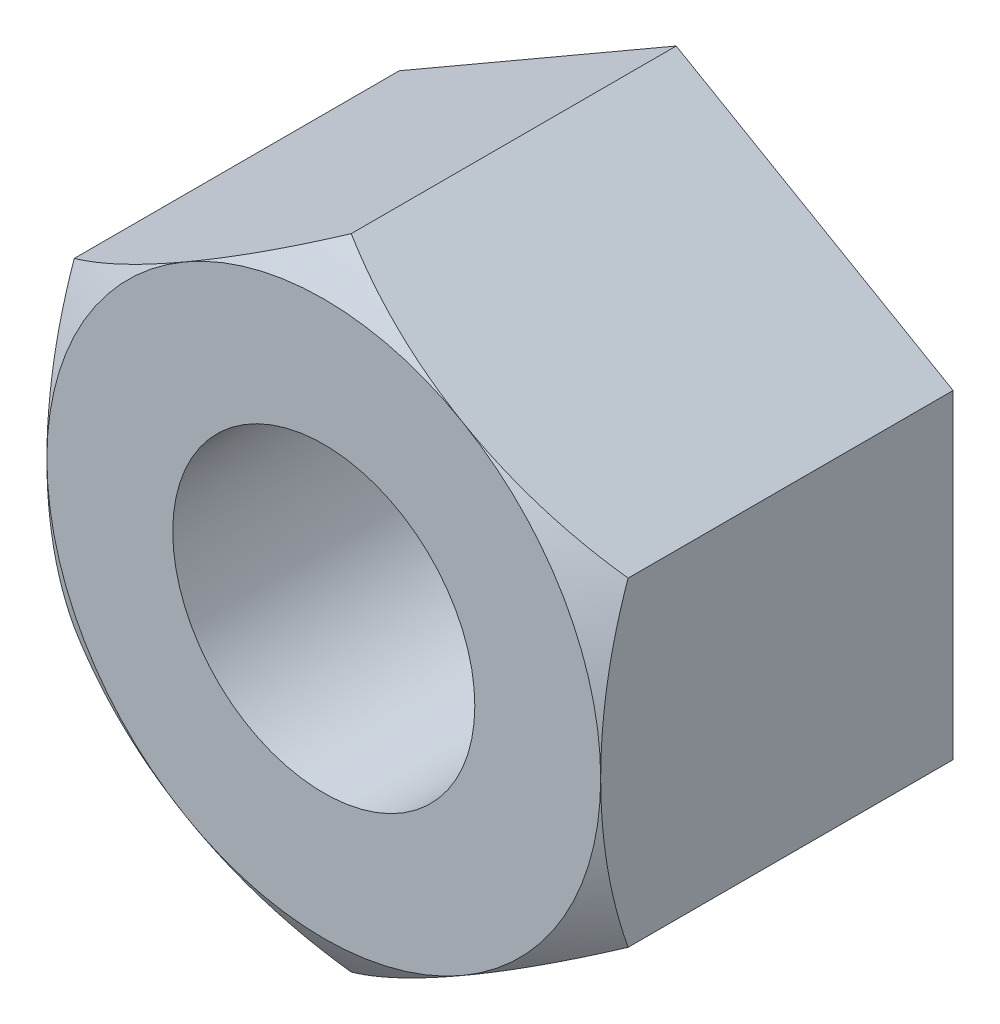
ISO-10303-21;
HEADER;
FILE_DESCRIPTION(('STEP AP214'),'2;1');
FILE_NAME('part.step','',(''),(''),'','','');
FILE_SCHEMA(('AUTOMOTIVE_DESIGN { 1 0 10303 214 1 1 1 1 }'));
ENDSEC;
DATA;
#1=APPLICATION_CONTEXT('core data for automotive mechanical design processes');
#2=APPLICATION_PROTOCOL_DEFINITION('international standard','automotive_design',2000,#1);
#3=PRODUCT_CONTEXT('',#1,'mechanical');
#4=PRODUCT('Part','Part','',(#3));
#5=PRODUCT_RELATED_PRODUCT_CATEGORY('part','',(#4));
#6=PRODUCT_DEFINITION_FORMATION('','',#4);
#7=PRODUCT_DEFINITION_CONTEXT('part definition',#1,'design');
#8=PRODUCT_DEFINITION('design','',#6,#7);
#9=PRODUCT_DEFINITION_SHAPE('','',#8);
#10=(LENGTH_UNIT() NAMED_UNIT(*) SI_UNIT(.MILLI.,.METRE.));
#11=(NAMED_UNIT(*) PLANE_ANGLE_UNIT() SI_UNIT($,.RADIAN.));
#12=(NAMED_UNIT(*) SI_UNIT($,.STERADIAN.) SOLID_ANGLE_UNIT());
#13=UNCERTAINTY_MEASURE_WITH_UNIT(LENGTH_MEASURE(1.E-05),#10,'distance_accuracy_value','');
#14=(GEOMETRIC_REPRESENTATION_CONTEXT(3) GLOBAL_UNCERTAINTY_ASSIGNED_CONTEXT((#13)) GLOBAL_UNIT_ASSIGNED_CONTEXT((#10,
#11,#12)) REPRESENTATION_CONTEXT('',''));
#15=CARTESIAN_POINT('',(0.,0.,0.));
#16=DIRECTION('',(0.,0.,1.));
#17=DIRECTION('',(1.,0.,0.));
#18=AXIS2_PLACEMENT_3D('',#15,#16,#17);
#19=CARTESIAN_POINT('',(0.,0.,3.5));
#20=DIRECTION('',(0.,0.,1.));
#21=DIRECTION('',(1.,0.,0.));
#22=AXIS2_PLACEMENT_3D('',#19,#20,#21);
#23=PLANE('',#22);
#24=CARTESIAN_POINT('',(0.,0.,3.49999999999998));
#25=DIRECTION('',(0.,0.,-1.));
#26=DIRECTION('',(0.,1.,0.));
#27=AXIS2_PLACEMENT_3D('',#24,#25,#26);
#28=CIRCLE('',#27,2.75);
#29=CARTESIAN_POINT('',(2.75,0.,3.49999999999998));
#30=VERTEX_POINT('',#29);
#31=CARTESIAN_POINT('',(1.37500000000002,-2.3815698604072,3.49999999999996));
#32=VERTEX_POINT('',#31);
#33=EDGE_CURVE('E176',#30,#32,#28,.T.);
#34=ORIENTED_EDGE('',*,*,#33,.F.);
#35=CARTESIAN_POINT('',(1.37499999999999,2.38156986040722,3.5));
#36=VERTEX_POINT('',#35);
#37=EDGE_CURVE('E175',#36,#30,#28,.T.);
#38=ORIENTED_EDGE('',*,*,#37,.F.);
#39=CARTESIAN_POINT('',(-1.375,2.38156986040721,3.5));
#40=VERTEX_POINT('',#39);
#41=EDGE_CURVE('E111',#40,#36,#28,.T.);
#42=ORIENTED_EDGE('',*,*,#41,.F.);
#43=CARTESIAN_POINT('',(-2.75,0.,3.49999999999998));
#44=VERTEX_POINT('',#43);
#45=EDGE_CURVE('E49',#44,#40,#28,.T.);
#46=ORIENTED_EDGE('',*,*,#45,.F.);
#47=CARTESIAN_POINT('',(-1.37499999999999,-2.38156986040721,3.49999999999996));
#48=VERTEX_POINT('',#47);
#49=EDGE_CURVE('E57',#48,#44,#28,.T.);
#50=ORIENTED_EDGE('',*,*,#49,.F.);
#51=EDGE_CURVE('E179',#32,#48,#28,.T.);
#52=ORIENTED_EDGE('',*,*,#51,.F.);
#53=EDGE_LOOP('',(#34,#38,#42,#46,#50,#52));
#54=FACE_BOUND('',#53,.T.);
#55=CARTESIAN_POINT('',(0.,0.,3.5));
#56=DIRECTION('',(0.,0.,1.));
#57=DIRECTION('',(1.,0.,0.));
#58=AXIS2_PLACEMENT_3D('',#55,#56,#57);
#59=CIRCLE('',#58,1.5);
#60=CARTESIAN_POINT('',(1.5,0.,3.5));
#61=VERTEX_POINT('',#60);
#62=EDGE_CURVE('E159',#61,#61,#59,.T.);
#63=ORIENTED_EDGE('',*,*,#62,.F.);
#64=EDGE_LOOP('',(#63));
#65=FACE_BOUND('',#64,.T.);
#66=ADVANCED_FACE('F34',(#54,#65),#23,.T.);
#67=CARTESIAN_POINT('',(0.,0.,0.));
#68=DIRECTION('',(0.,0.,1.));
#69=DIRECTION('',(1.,0.,0.));
#70=AXIS2_PLACEMENT_3D('',#67,#68,#69);
#71=PLANE('',#70);
#72=DIRECTION('',(-0.866025403784442,0.499999999999995,0.));
#73=VECTOR('',#72,1.);
#74=CARTESIAN_POINT('',(2.74999999999998,1.5877132402715,0.));
#75=LINE('',#74,#73);
#76=CARTESIAN_POINT('',(2.74999999999998,1.5877132402715,0.));
#77=VERTEX_POINT('',#76);
#78=CARTESIAN_POINT('',(0.,3.17542648054294,0.));
#79=VERTEX_POINT('',#78);
#80=EDGE_CURVE('E131',#77,#79,#75,.T.);
#81=ORIENTED_EDGE('',*,*,#80,.F.);
#82=DIRECTION('',(0.,1.,0.));
#83=VECTOR('',#82,1.);
#84=CARTESIAN_POINT('',(2.75000000000002,-1.58771324027145,0.));
#85=LINE('',#84,#83);
#86=CARTESIAN_POINT('',(2.75000000000002,-1.58771324027145,0.));
#87=VERTEX_POINT('',#86);
#88=EDGE_CURVE('E144',#87,#77,#85,.T.);
#89=ORIENTED_EDGE('',*,*,#88,.F.);
#90=DIRECTION('',(0.866025403784435,0.500000000000007,0.));
#91=VECTOR('',#90,1.);
#92=CARTESIAN_POINT('',(0.,-3.17542648054294,0.));
#93=LINE('',#92,#91);
#94=CARTESIAN_POINT('',(0.,-3.17542648054294,0.));
#95=VERTEX_POINT('',#94);
#96=EDGE_CURVE('E147',#95,#87,#93,.T.);
#97=ORIENTED_EDGE('',*,*,#96,.F.);
#98=DIRECTION('',(0.866025403784441,-0.499999999999995,0.));
#99=VECTOR('',#98,1.);
#100=CARTESIAN_POINT('',(-2.74999999999999,-1.58771324027148,0.));
#101=LINE('',#100,#99);
#102=CARTESIAN_POINT('',(-2.74999999999999,-1.58771324027148,0.));
#103=VERTEX_POINT('',#102);
#104=EDGE_CURVE('E150',#103,#95,#101,.T.);
#105=ORIENTED_EDGE('',*,*,#104,.F.);
#106=DIRECTION('',(0.,-1.,0.));
#107=VECTOR('',#106,1.);
#108=CARTESIAN_POINT('',(-2.75,1.58771324027147,0.));
#109=LINE('',#108,#107);
#110=CARTESIAN_POINT('',(-2.75,1.58771324027147,0.));
#111=VERTEX_POINT('',#110);
#112=EDGE_CURVE('E153',#111,#103,#109,.T.);
#113=ORIENTED_EDGE('',*,*,#112,.F.);
#114=DIRECTION('',(-0.866025403784438,-0.500000000000001,0.));
#115=VECTOR('',#114,1.);
#116=CARTESIAN_POINT('',(0.,3.17542648054294,0.));
#117=LINE('',#116,#115);
#118=EDGE_CURVE('E156',#79,#111,#117,.T.);
#119=ORIENTED_EDGE('',*,*,#118,.F.);
#120=EDGE_LOOP('',(#81,#89,#97,#105,#113,#119));
#121=FACE_BOUND('',#120,.T.);
#122=CARTESIAN_POINT('',(0.,0.,0.));
#123=DIRECTION('',(0.,0.,1.));
#124=DIRECTION('',(1.,0.,0.));
#125=AXIS2_PLACEMENT_3D('',#122,#123,#124);
#126=CIRCLE('',#125,1.5);
#127=CARTESIAN_POINT('',(1.5,0.,0.));
#128=VERTEX_POINT('',#127);
#129=EDGE_CURVE('E160',#128,#128,#126,.T.);
#130=ORIENTED_EDGE('',*,*,#129,.T.);
#131=EDGE_LOOP('',(#130));
#132=FACE_BOUND('',#131,.T.);
#133=ADVANCED_FACE('F205',(#121,#132),#71,.F.);
#134=CARTESIAN_POINT('',(2.74999999999998,1.5877132402715,3.5));
#135=DIRECTION('',(-0.499999999999995,-0.866025403784442,0.));
#136=DIRECTION('',(0.866025403784442,-0.499999999999995,0.));
#137=AXIS2_PLACEMENT_3D('',#134,#135,#136);
#138=PLANE('',#137);
#139=DIRECTION('',(0.,0.,-1.));
#140=VECTOR('',#139,1.);
#141=CARTESIAN_POINT('',(0.,3.17542648054294,3.5));
#142=LINE('',#141,#140);
#143=CARTESIAN_POINT('',(0.,3.17542648054294,3.22759147428808));
#144=VERTEX_POINT('',#143);
#145=EDGE_CURVE('E124',#144,#79,#142,.T.);
#146=ORIENTED_EDGE('',*,*,#145,.F.);
#147=CARTESIAN_POINT('',(1.37499999999999,2.38156986040722,-1.26313972081448));
#148=DIRECTION('',(-0.499999999999995,-0.866025403784442,0.));
#149=DIRECTION('',(0.866025403784442,-0.499999999999995,0.));
#150=AXIS2_PLACEMENT_3D('',#147,#148,#149);
#151=CIRCLE('',#150,4.76313972081447);
#152=EDGE_CURVE('E105',#144,#36,#151,.F.);
#153=ORIENTED_EDGE('',*,*,#152,.T.);
#154=CARTESIAN_POINT('',(2.74999999999998,1.5877132402715,3.22759147428807));
#155=VERTEX_POINT('',#154);
#156=EDGE_CURVE('E118',#36,#155,#151,.F.);
#157=ORIENTED_EDGE('',*,*,#156,.T.);
#158=DIRECTION('',(0.,0.,-1.));
#159=VECTOR('',#158,1.);
#160=CARTESIAN_POINT('',(2.74999999999998,1.5877132402715,3.5));
#161=LINE('',#160,#159);
#162=EDGE_CURVE('E142',#155,#77,#161,.T.);
#163=ORIENTED_EDGE('',*,*,#162,.T.);
#164=ORIENTED_EDGE('',*,*,#80,.T.);
#165=EDGE_LOOP('',(#146,#153,#157,#163,#164));
#166=FACE_BOUND('',#165,.T.);
#167=ADVANCED_FACE('F36',(#166),#138,.F.);
#168=CARTESIAN_POINT('',(0.,3.17542648054294,3.5));
#169=DIRECTION('',(0.500000000000001,-0.866025403784438,0.));
#170=DIRECTION('',(0.866025403784438,0.500000000000001,0.));
#171=AXIS2_PLACEMENT_3D('',#168,#169,#170);
#172=PLANE('',#171);
#173=DIRECTION('',(0.,0.,-1.));
#174=VECTOR('',#173,1.);
#175=CARTESIAN_POINT('',(-2.75,1.58771324027147,3.5));
#176=LINE('',#175,#174);
#177=CARTESIAN_POINT('',(-2.75,1.58771324027146,3.22759147428807));
#178=VERTEX_POINT('',#177);
#179=EDGE_CURVE('E132',#178,#111,#176,.T.);
#180=ORIENTED_EDGE('',*,*,#179,.F.);
#181=CARTESIAN_POINT('',(-1.375,2.3815698604072,-1.26313972081448));
#182=DIRECTION('',(0.500000000000001,-0.866025403784438,0.));
#183=DIRECTION('',(0.866025403784438,0.500000000000001,0.));
#184=AXIS2_PLACEMENT_3D('',#181,#182,#183);
#185=CIRCLE('',#184,4.76313972081448);
#186=EDGE_CURVE('E126',#178,#40,#185,.F.);
#187=ORIENTED_EDGE('',*,*,#186,.T.);
#188=EDGE_CURVE('E108',#40,#144,#185,.F.);
#189=ORIENTED_EDGE('',*,*,#188,.T.);
#190=ORIENTED_EDGE('',*,*,#145,.T.);
#191=ORIENTED_EDGE('',*,*,#118,.T.);
#192=EDGE_LOOP('',(#180,#187,#189,#190,#191));
#193=FACE_BOUND('',#192,.T.);
#194=ADVANCED_FACE('F122',(#193),#172,.F.);
#195=CARTESIAN_POINT('',(-2.75,1.58771324027147,3.5));
#196=DIRECTION('',(1.,0.,0.));
#197=DIRECTION('',(0.,1.,0.));
#198=AXIS2_PLACEMENT_3D('',#195,#196,#197);
#199=PLANE('',#198);
#200=DIRECTION('',(0.,0.,-1.));
#201=VECTOR('',#200,1.);
#202=CARTESIAN_POINT('',(-2.74999999999999,-1.58771324027148,3.5));
#203=LINE('',#202,#201);
#204=CARTESIAN_POINT('',(-2.74999999999997,-1.58771324027153,3.22759147428804));
#205=VERTEX_POINT('',#204);
#206=EDGE_CURVE('E134',#205,#103,#203,.T.);
#207=ORIENTED_EDGE('',*,*,#206,.F.);
#208=CARTESIAN_POINT('',(-2.75,0.,-1.26313972081448));
#209=DIRECTION('',(1.,0.,0.));
#210=DIRECTION('',(0.,1.,0.));
#211=AXIS2_PLACEMENT_3D('',#208,#209,#210);
#212=CIRCLE('',#211,4.76313972081448);
#213=EDGE_CURVE('E163',#205,#44,#212,.F.);
#214=ORIENTED_EDGE('',*,*,#213,.T.);
#215=EDGE_CURVE('E166',#44,#178,#212,.F.);
#216=ORIENTED_EDGE('',*,*,#215,.T.);
#217=ORIENTED_EDGE('',*,*,#179,.T.);
#218=ORIENTED_EDGE('',*,*,#112,.T.);
#219=EDGE_LOOP('',(#207,#214,#216,#217,#218));
#220=FACE_BOUND('',#219,.T.);
#221=ADVANCED_FACE('F210',(#220),#199,.F.);
#222=CARTESIAN_POINT('',(-2.74999999999999,-1.58771324027148,3.5));
#223=DIRECTION('',(0.499999999999995,0.866025403784441,0.));
#224=DIRECTION('',(-0.866025403784442,0.499999999999995,0.));
#225=AXIS2_PLACEMENT_3D('',#222,#223,#224);
#226=PLANE('',#225);
#227=DIRECTION('',(0.,0.,-1.));
#228=VECTOR('',#227,1.);
#229=CARTESIAN_POINT('',(0.,-3.17542648054294,3.5));
#230=LINE('',#229,#228);
#231=CARTESIAN_POINT('',(0.,-3.17542648054294,3.22759147428803));
#232=VERTEX_POINT('',#231);
#233=EDGE_CURVE('E138',#232,#95,#230,.T.);
#234=ORIENTED_EDGE('',*,*,#233,.F.);
#235=CARTESIAN_POINT('',(-1.37499999999999,-2.38156986040721,-1.26313972081448));
#236=DIRECTION('',(0.499999999999995,0.866025403784441,0.));
#237=DIRECTION('',(-0.866025403784442,0.499999999999995,0.));
#238=AXIS2_PLACEMENT_3D('',#235,#236,#237);
#239=CIRCLE('',#238,4.76313972081448);
#240=EDGE_CURVE('E127',#232,#48,#239,.F.);
#241=ORIENTED_EDGE('',*,*,#240,.T.);
#242=EDGE_CURVE('E168',#48,#205,#239,.F.);
#243=ORIENTED_EDGE('',*,*,#242,.T.);
#244=ORIENTED_EDGE('',*,*,#206,.T.);
#245=ORIENTED_EDGE('',*,*,#104,.T.);
#246=EDGE_LOOP('',(#234,#241,#243,#244,#245));
#247=FACE_BOUND('',#246,.T.);
#248=ADVANCED_FACE('F193',(#247),#226,.F.);
#249=CARTESIAN_POINT('',(0.,-3.17542648054294,3.5));
#250=DIRECTION('',(-0.500000000000007,0.866025403784434,0.));
#251=DIRECTION('',(-0.866025403784435,-0.500000000000007,0.));
#252=AXIS2_PLACEMENT_3D('',#249,#250,#251);
#253=PLANE('',#252);
#254=DIRECTION('',(0.,0.,-1.));
#255=VECTOR('',#254,1.);
#256=CARTESIAN_POINT('',(2.75000000000002,-1.58771324027145,3.5));
#257=LINE('',#256,#255);
#258=CARTESIAN_POINT('',(2.75000000000002,-1.58771324027145,3.22759147428808));
#259=VERTEX_POINT('',#258);
#260=EDGE_CURVE('E140',#259,#87,#257,.T.);
#261=ORIENTED_EDGE('',*,*,#260,.F.);
#262=CARTESIAN_POINT('',(1.37500000000002,-2.38156986040719,-1.26313972081448));
#263=DIRECTION('',(-0.500000000000007,0.866025403784434,0.));
#264=DIRECTION('',(-0.866025403784435,-0.500000000000007,0.));
#265=AXIS2_PLACEMENT_3D('',#262,#263,#264);
#266=CIRCLE('',#265,4.76313972081448);
#267=EDGE_CURVE('E172',#259,#32,#266,.F.);
#268=ORIENTED_EDGE('',*,*,#267,.T.);
#269=EDGE_CURVE('E117',#32,#232,#266,.F.);
#270=ORIENTED_EDGE('',*,*,#269,.T.);
#271=ORIENTED_EDGE('',*,*,#233,.T.);
#272=ORIENTED_EDGE('',*,*,#96,.T.);
#273=EDGE_LOOP('',(#261,#268,#270,#271,#272));
#274=FACE_BOUND('',#273,.T.);
#275=ADVANCED_FACE('F229',(#274),#253,.F.);
#276=CARTESIAN_POINT('',(2.75000000000002,-1.58771324027145,3.5));
#277=DIRECTION('',(-1.,0.,0.));
#278=DIRECTION('',(0.,-1.,0.));
#279=AXIS2_PLACEMENT_3D('',#276,#277,#278);
#280=PLANE('',#279);
#281=ORIENTED_EDGE('',*,*,#162,.F.);
#282=CARTESIAN_POINT('',(2.75,0.,-1.26313972081448));
#283=DIRECTION('',(-1.,0.,0.));
#284=DIRECTION('',(0.,-1.,0.));
#285=AXIS2_PLACEMENT_3D('',#282,#283,#284);
#286=CIRCLE('',#285,4.76313972081448);
#287=EDGE_CURVE('E11',#155,#30,#286,.F.);
#288=ORIENTED_EDGE('',*,*,#287,.T.);
#289=EDGE_CURVE('E38',#30,#259,#286,.F.);
#290=ORIENTED_EDGE('',*,*,#289,.T.);
#291=ORIENTED_EDGE('',*,*,#260,.T.);
#292=ORIENTED_EDGE('',*,*,#88,.T.);
#293=EDGE_LOOP('',(#281,#288,#290,#291,#292));
#294=FACE_BOUND('',#293,.T.);
#295=ADVANCED_FACE('F200',(#294),#280,.F.);
#296=CARTESIAN_POINT('',(0.,0.,3.5));
#297=DIRECTION('',(0.,0.,-1.));
#298=DIRECTION('',(-1.,0.,0.));
#299=AXIS2_PLACEMENT_3D('',#296,#297,#298);
#300=CYLINDRICAL_SURFACE('',#299,1.5);
#301=ORIENTED_EDGE('',*,*,#62,.T.);
#302=EDGE_LOOP('',(#301));
#303=FACE_BOUND('',#302,.T.);
#304=ORIENTED_EDGE('',*,*,#129,.F.);
#305=EDGE_LOOP('',(#304));
#306=FACE_BOUND('',#305,.T.);
#307=ADVANCED_FACE('F225',(#303,#306),#300,.F.);
#308=CARTESIAN_POINT('',(0.,0.,-1.26313972081448));
#309=DIRECTION('',(0.,0.,-1.));
#310=DIRECTION('',(0.,1.,0.));
#311=AXIS2_PLACEMENT_3D('',#308,#309,#310);
#312=SPHERICAL_SURFACE('',#311,5.50000000000006);
#313=ORIENTED_EDGE('',*,*,#289,.F.);
#314=ORIENTED_EDGE('',*,*,#33,.T.);
#315=ORIENTED_EDGE('',*,*,#267,.F.);
#316=EDGE_LOOP('',(#313,#314,#315));
#317=FACE_BOUND('',#316,.T.);
#318=ADVANCED_FACE('F196',(#317),#312,.T.);
#319=ORIENTED_EDGE('',*,*,#37,.T.);
#320=ORIENTED_EDGE('',*,*,#287,.F.);
#321=ORIENTED_EDGE('',*,*,#156,.F.);
#322=EDGE_LOOP('',(#319,#320,#321));
#323=FACE_BOUND('',#322,.T.);
#324=ADVANCED_FACE('F201',(#323),#312,.T.);
#325=ORIENTED_EDGE('',*,*,#269,.F.);
#326=ORIENTED_EDGE('',*,*,#51,.T.);
#327=ORIENTED_EDGE('',*,*,#240,.F.);
#328=EDGE_LOOP('',(#325,#326,#327));
#329=FACE_BOUND('',#328,.T.);
#330=ADVANCED_FACE('F183',(#329),#312,.T.);
#331=ORIENTED_EDGE('',*,*,#242,.F.);
#332=ORIENTED_EDGE('',*,*,#49,.T.);
#333=ORIENTED_EDGE('',*,*,#213,.F.);
#334=EDGE_LOOP('',(#331,#332,#333));
#335=FACE_BOUND('',#334,.T.);
#336=ADVANCED_FACE('F188',(#335),#312,.T.);
#337=ORIENTED_EDGE('',*,*,#45,.T.);
#338=ORIENTED_EDGE('',*,*,#186,.F.);
#339=ORIENTED_EDGE('',*,*,#215,.F.);
#340=EDGE_LOOP('',(#337,#338,#339));
#341=FACE_BOUND('',#340,.T.);
#342=ADVANCED_FACE('F211',(#341),#312,.T.);
#343=ORIENTED_EDGE('',*,*,#41,.T.);
#344=ORIENTED_EDGE('',*,*,#152,.F.);
#345=ORIENTED_EDGE('',*,*,#188,.F.);
#346=EDGE_LOOP('',(#343,#344,#345));
#347=FACE_BOUND('',#346,.T.);
#348=ADVANCED_FACE('F107',(#347),#312,.T.);
#349=CLOSED_SHELL('',(#66,#133,#167,#194,#221,#248,#275,#295,#307,#318,#324,#330,#336,#342,#348));
#350=MANIFOLD_SOLID_BREP('B2',#349);
#351=ADVANCED_BREP_SHAPE_REPRESENTATION('',(#18,#350),#14);
#352=SHAPE_DEFINITION_REPRESENTATION(#9,#351);
ENDSEC;
END-ISO-10303-21;
